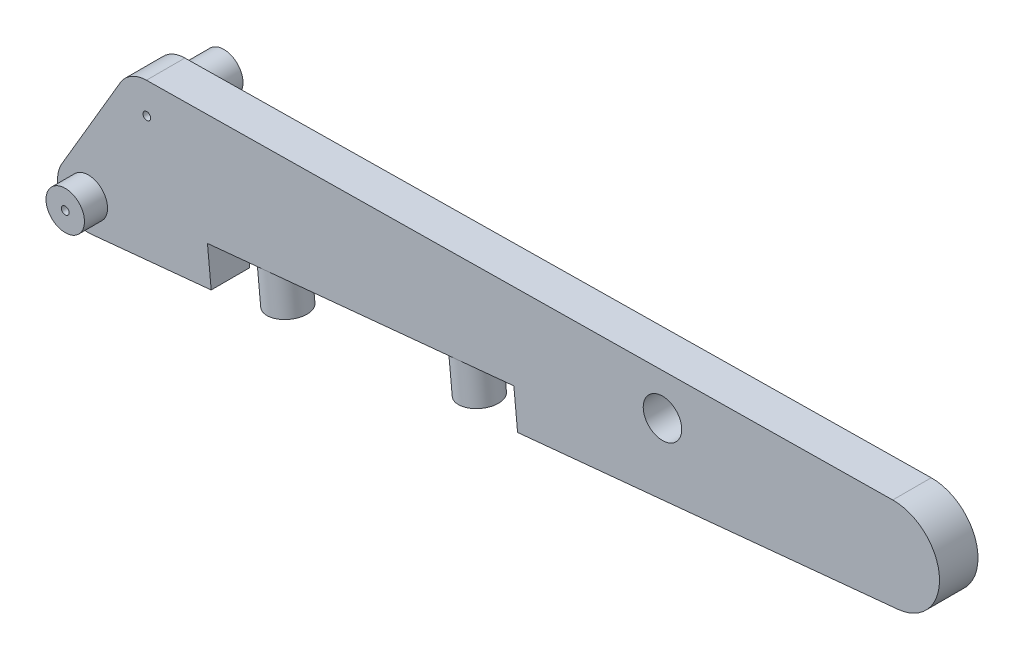
ISO-10303-21;
HEADER;
FILE_DESCRIPTION(('STEP AP214'),'2;1');
FILE_NAME('part.step','',(''),(''),'','','');
FILE_SCHEMA(('AUTOMOTIVE_DESIGN { 1 0 10303 214 1 1 1 1 }'));
ENDSEC;
DATA;
#1=APPLICATION_CONTEXT('core data for automotive mechanical design processes');
#2=APPLICATION_PROTOCOL_DEFINITION('international standard','automotive_design',2000,#1);
#3=PRODUCT_CONTEXT('',#1,'mechanical');
#4=PRODUCT('Part','Part','',(#3));
#5=PRODUCT_RELATED_PRODUCT_CATEGORY('part','',(#4));
#6=PRODUCT_DEFINITION_FORMATION('','',#4);
#7=PRODUCT_DEFINITION_CONTEXT('part definition',#1,'design');
#8=PRODUCT_DEFINITION('design','',#6,#7);
#9=PRODUCT_DEFINITION_SHAPE('','',#8);
#10=(LENGTH_UNIT() NAMED_UNIT(*) SI_UNIT(.MILLI.,.METRE.));
#11=(NAMED_UNIT(*) PLANE_ANGLE_UNIT() SI_UNIT($,.RADIAN.));
#12=(NAMED_UNIT(*) SI_UNIT($,.STERADIAN.) SOLID_ANGLE_UNIT());
#13=UNCERTAINTY_MEASURE_WITH_UNIT(LENGTH_MEASURE(1.E-05),#10,'distance_accuracy_value','');
#14=(GEOMETRIC_REPRESENTATION_CONTEXT(3) GLOBAL_UNCERTAINTY_ASSIGNED_CONTEXT((#13)) GLOBAL_UNIT_ASSIGNED_CONTEXT((#10,
#11,#12)) REPRESENTATION_CONTEXT('',''));
#15=CARTESIAN_POINT('',(0.,0.,0.));
#16=DIRECTION('',(0.,0.,1.));
#17=DIRECTION('',(1.,0.,0.));
#18=AXIS2_PLACEMENT_3D('',#15,#16,#17);
#19=CARTESIAN_POINT('',(47.6890944429912,-6.52502358700781,5.));
#20=DIRECTION('',(-0.0968281530487967,0.995301114626704,0.));
#21=DIRECTION('',(-0.995301114626704,-0.0968281530487967,0.));
#22=AXIS2_PLACEMENT_3D('',#19,#20,#21);
#23=PLANE('',#22);
#24=CARTESIAN_POINT('',(40.2243360832909,-7.25123473487379,2.5));
#25=DIRECTION('',(0.0968281530487967,-0.995301114626704,0.));
#26=DIRECTION('',(0.995301114626704,0.0968281530487967,0.));
#27=AXIS2_PLACEMENT_3D('',#24,#25,#26);
#28=CIRCLE('',#27,2.5);
#29=CARTESIAN_POINT('',(40.2243360832909,-7.25123473487379,0.));
#30=VERTEX_POINT('',#29);
#31=CARTESIAN_POINT('',(40.2243360832909,-7.25123473487379,5.));
#32=VERTEX_POINT('',#31);
#33=EDGE_CURVE('E150',#30,#32,#28,.T.);
#34=ORIENTED_EDGE('',*,*,#33,.F.);
#35=DIRECTION('',(0.995301114626704,0.0968281530487967,0.));
#36=VECTOR('',#35,1.);
#37=CARTESIAN_POINT('',(47.6890944429912,-6.52502358700781,0.));
#38=LINE('',#37,#36);
#39=CARTESIAN_POINT('',(47.6890944429912,-6.52502358700781,0.));
#40=VERTEX_POINT('',#39);
#41=EDGE_CURVE('E136',#30,#40,#38,.T.);
#42=ORIENTED_EDGE('',*,*,#41,.T.);
#43=DIRECTION('',(0.,0.,-1.));
#44=VECTOR('',#43,1.);
#45=CARTESIAN_POINT('',(47.6890944429912,-6.52502358700781,5.));
#46=LINE('',#45,#44);
#47=CARTESIAN_POINT('',(47.6890944429912,-6.52502358700781,5.));
#48=VERTEX_POINT('',#47);
#49=EDGE_CURVE('E199',#48,#40,#46,.T.);
#50=ORIENTED_EDGE('',*,*,#49,.F.);
#51=DIRECTION('',(0.995301114626704,0.0968281530487967,0.));
#52=VECTOR('',#51,1.);
#53=CARTESIAN_POINT('',(47.6890944429912,-6.52502358700781,5.));
#54=LINE('',#53,#52);
#55=EDGE_CURVE('E151',#32,#48,#54,.T.);
#56=ORIENTED_EDGE('',*,*,#55,.F.);
#57=EDGE_LOOP('',(#34,#42,#50,#56));
#58=FACE_BOUND('',#57,.T.);
#59=ADVANCED_FACE('F39',(#58),#23,.F.);
#60=EDGE_CURVE('E55',#32,#30,#28,.T.);
#61=ORIENTED_EDGE('',*,*,#60,.F.);
#62=CARTESIAN_POINT('',(15.3418082176233,-9.6719385610937,5.));
#63=VERTEX_POINT('',#62);
#64=EDGE_CURVE('E192',#63,#32,#54,.T.);
#65=ORIENTED_EDGE('',*,*,#64,.F.);
#66=CARTESIAN_POINT('',(15.3418082176233,-9.6719385610937,2.5));
#67=DIRECTION('',(-0.0968281530487967,0.995301114626704,0.));
#68=DIRECTION('',(-0.995301114626704,-0.0968281530487967,0.));
#69=AXIS2_PLACEMENT_3D('',#66,#67,#68);
#70=CIRCLE('',#69,2.5);
#71=CARTESIAN_POINT('',(15.3418082176233,-9.67193856109371,0.));
#72=VERTEX_POINT('',#71);
#73=EDGE_CURVE('E11',#72,#63,#70,.F.);
#74=ORIENTED_EDGE('',*,*,#73,.F.);
#75=EDGE_CURVE('E129',#72,#30,#38,.T.);
#76=ORIENTED_EDGE('',*,*,#75,.T.);
#77=EDGE_LOOP('',(#61,#65,#74,#76));
#78=FACE_BOUND('',#77,.T.);
#79=ADVANCED_FACE('F131',(#78),#23,.F.);
#80=CARTESIAN_POINT('',(97.5809689182928,-6.71860047068932,5.));
#81=DIRECTION('',(-0.0968281530487968,0.995301114626704,0.));
#82=DIRECTION('',(-0.995301114626704,-0.0968281530487968,0.));
#83=AXIS2_PLACEMENT_3D('',#80,#81,#82);
#84=PLANE('',#83);
#85=DIRECTION('',(0.995301114626704,0.0968281530487968,0.));
#86=VECTOR('',#85,1.);
#87=CARTESIAN_POINT('',(97.5809689182928,-6.71860047068932,5.));
#88=LINE('',#87,#86);
#89=CARTESIAN_POINT('',(48.1755208702595,-11.5250235870078,5.));
#90=VERTEX_POINT('',#89);
#91=CARTESIAN_POINT('',(97.5809689182928,-6.71860047068932,5.));
#92=VERTEX_POINT('',#91);
#93=EDGE_CURVE('E263',#90,#92,#88,.T.);
#94=ORIENTED_EDGE('',*,*,#93,.F.);
#95=DIRECTION('',(0.,0.,-1.));
#96=VECTOR('',#95,1.);
#97=CARTESIAN_POINT('',(48.1755208702595,-11.5250235870078,5.));
#98=LINE('',#97,#96);
#99=CARTESIAN_POINT('',(48.1755208702595,-11.5250235870078,0.));
#100=VERTEX_POINT('',#99);
#101=EDGE_CURVE('E191',#90,#100,#98,.T.);
#102=ORIENTED_EDGE('',*,*,#101,.T.);
#103=DIRECTION('',(0.995301114626704,0.0968281530487968,0.));
#104=VECTOR('',#103,1.);
#105=CARTESIAN_POINT('',(97.5809689182928,-6.71860047068932,0.));
#106=LINE('',#105,#104);
#107=CARTESIAN_POINT('',(97.5809689182928,-6.71860047068932,0.));
#108=VERTEX_POINT('',#107);
#109=EDGE_CURVE('E284',#100,#108,#106,.T.);
#110=ORIENTED_EDGE('',*,*,#109,.T.);
#111=DIRECTION('',(0.,0.,-1.));
#112=VECTOR('',#111,1.);
#113=CARTESIAN_POINT('',(97.5809689182928,-6.71860047068932,5.));
#114=LINE('',#113,#112);
#115=EDGE_CURVE('E301',#92,#108,#114,.T.);
#116=ORIENTED_EDGE('',*,*,#115,.F.);
#117=EDGE_LOOP('',(#94,#102,#110,#116));
#118=FACE_BOUND('',#117,.T.);
#119=ADVANCED_FACE('F354',(#118),#84,.F.);
#120=CARTESIAN_POINT('',(0.,0.,5.));
#121=DIRECTION('',(0.,0.,1.));
#122=DIRECTION('',(1.,0.,0.));
#123=AXIS2_PLACEMENT_3D('',#120,#121,#122);
#124=PLANE('',#123);
#125=DIRECTION('',(0.0968281530487984,-0.995301114626703,0.));
#126=VECTOR('',#125,1.);
#127=CARTESIAN_POINT('',(48.1755208702595,-11.5250235870078,5.));
#128=LINE('',#127,#126);
#129=EDGE_CURVE('E179',#48,#90,#128,.T.);
#130=ORIENTED_EDGE('',*,*,#129,.T.);
#131=ORIENTED_EDGE('',*,*,#93,.T.);
#132=CARTESIAN_POINT('',(97.,-0.746793782929099,5.));
#133=DIRECTION('',(0.,0.,1.));
#134=DIRECTION('',(1.,0.,0.));
#135=AXIS2_PLACEMENT_3D('',#132,#133,#134);
#136=CIRCLE('',#135,6.);
#137=CARTESIAN_POINT('',(96.9224782338776,5.25270539415037,5.));
#138=VERTEX_POINT('',#137);
#139=EDGE_CURVE('E268',#92,#138,#136,.T.);
#140=ORIENTED_EDGE('',*,*,#139,.T.);
#141=DIRECTION('',(-0.999916529513246,-0.0129202943537264,0.));
#142=VECTOR('',#141,1.);
#143=CARTESIAN_POINT('',(-0.0516811774149059,3.99966611805298,5.));
#144=LINE('',#143,#142);
#145=CARTESIAN_POINT('',(-0.0516811774149059,3.99966611805298,5.));
#146=VERTEX_POINT('',#145);
#147=EDGE_CURVE('E271',#138,#146,#144,.T.);
#148=ORIENTED_EDGE('',*,*,#147,.T.);
#149=CARTESIAN_POINT('',(0.,0.,5.));
#150=DIRECTION('',(0.,0.,1.));
#151=DIRECTION('',(1.,0.,0.));
#152=AXIS2_PLACEMENT_3D('',#149,#150,#151);
#153=CIRCLE('',#152,4.);
#154=CARTESIAN_POINT('',(-3.4486016019758,2.02660972830239,5.));
#155=VERTEX_POINT('',#154);
#156=EDGE_CURVE('E252',#146,#155,#153,.T.);
#157=ORIENTED_EDGE('',*,*,#156,.T.);
#158=DIRECTION('',(-0.506652432075599,-0.862150400493951,0.));
#159=VECTOR('',#158,1.);
#160=CARTESIAN_POINT('',(-11.0483880831098,-10.9056462791069,5.));
#161=LINE('',#160,#159);
#162=CARTESIAN_POINT('',(-11.0483880831098,-10.9056462791069,5.));
#163=VERTEX_POINT('',#162);
#164=EDGE_CURVE('E256',#155,#163,#161,.T.);
#165=ORIENTED_EDGE('',*,*,#164,.T.);
#166=CARTESIAN_POINT('',(-7.59978648113398,-12.9322560074093,5.));
#167=DIRECTION('',(0.,0.,1.));
#168=DIRECTION('',(1.,0.,0.));
#169=AXIS2_PLACEMENT_3D('',#166,#167,#168);
#170=CIRCLE('',#169,4.);
#171=CARTESIAN_POINT('',(-7.21247386893879,-16.9134604659161,5.));
#172=VERTEX_POINT('',#171);
#173=EDGE_CURVE('E260',#163,#172,#170,.T.);
#174=ORIENTED_EDGE('',*,*,#173,.T.);
#175=CARTESIAN_POINT('',(8.36347628519138,-15.3981497089597,5.));
#176=VERTEX_POINT('',#175);
#177=EDGE_CURVE('E264',#172,#176,#88,.T.);
#178=ORIENTED_EDGE('',*,*,#177,.T.);
#179=DIRECTION('',(-0.0968281530487964,0.995301114626704,0.));
#180=VECTOR('',#179,1.);
#181=CARTESIAN_POINT('',(8.3634762851913,-15.3981497089597,5.));
#182=LINE('',#181,#180);
#183=CARTESIAN_POINT('',(7.87704985792304,-10.3981497089597,5.));
#184=VERTEX_POINT('',#183);
#185=EDGE_CURVE('E183',#176,#184,#182,.T.);
#186=ORIENTED_EDGE('',*,*,#185,.T.);
#187=EDGE_CURVE('E187',#184,#63,#54,.T.);
#188=ORIENTED_EDGE('',*,*,#187,.T.);
#189=ORIENTED_EDGE('',*,*,#64,.T.);
#190=ORIENTED_EDGE('',*,*,#55,.T.);
#191=EDGE_LOOP('',(#130,#131,#140,#148,#157,#165,#174,#178,#186,#188,#189,#190));
#192=FACE_BOUND('',#191,.T.);
#193=CARTESIAN_POINT('',(67.,-0.515826633569584,5.));
#194=DIRECTION('',(0.,0.,-1.));
#195=DIRECTION('',(-1.,0.,0.));
#196=AXIS2_PLACEMENT_3D('',#193,#194,#195);
#197=CIRCLE('',#196,2.49999999999999);
#198=CARTESIAN_POINT('',(64.5,-0.515826633569584,5.));
#199=VERTEX_POINT('',#198);
#200=EDGE_CURVE('E212',#199,#199,#197,.T.);
#201=ORIENTED_EDGE('',*,*,#200,.T.);
#202=EDGE_LOOP('',(#201));
#203=FACE_BOUND('',#202,.T.);
#204=CARTESIAN_POINT('',(-7.59978648113398,-12.9322560074093,5.));
#205=DIRECTION('',(0.,0.,1.));
#206=DIRECTION('',(1.,0.,0.));
#207=AXIS2_PLACEMENT_3D('',#204,#205,#206);
#208=CIRCLE('',#207,2.5);
#209=CARTESIAN_POINT('',(-5.09978648113398,-12.9322560074093,5.));
#210=VERTEX_POINT('',#209);
#211=EDGE_CURVE('E247',#210,#210,#208,.T.);
#212=ORIENTED_EDGE('',*,*,#211,.F.);
#213=EDGE_LOOP('',(#212));
#214=FACE_BOUND('',#213,.T.);
#215=CARTESIAN_POINT('',(0.,0.,5.));
#216=DIRECTION('',(0.,0.,1.));
#217=DIRECTION('',(1.,0.,0.));
#218=AXIS2_PLACEMENT_3D('',#215,#216,#217);
#219=CIRCLE('',#218,0.5);
#220=CARTESIAN_POINT('',(0.5,0.,5.));
#221=VERTEX_POINT('',#220);
#222=EDGE_CURVE('E231',#221,#221,#219,.T.);
#223=ORIENTED_EDGE('',*,*,#222,.F.);
#224=EDGE_LOOP('',(#223));
#225=FACE_BOUND('',#224,.T.);
#226=ADVANCED_FACE('F336',(#192,#203,#214,#225),#124,.T.);
#227=CARTESIAN_POINT('',(0.,0.,0.));
#228=DIRECTION('',(0.,0.,1.));
#229=DIRECTION('',(1.,0.,0.));
#230=AXIS2_PLACEMENT_3D('',#227,#228,#229);
#231=PLANE('',#230);
#232=CARTESIAN_POINT('',(67.,-0.515826633569584,0.));
#233=DIRECTION('',(0.,0.,-1.));
#234=DIRECTION('',(-1.,0.,0.));
#235=AXIS2_PLACEMENT_3D('',#232,#233,#234);
#236=CIRCLE('',#235,2.49999999999999);
#237=CARTESIAN_POINT('',(64.5,-0.515826633569584,0.));
#238=VERTEX_POINT('',#237);
#239=EDGE_CURVE('E202',#238,#238,#236,.T.);
#240=ORIENTED_EDGE('',*,*,#239,.F.);
#241=EDGE_LOOP('',(#240));
#242=FACE_BOUND('',#241,.T.);
#243=ORIENTED_EDGE('',*,*,#109,.F.);
#244=DIRECTION('',(0.0968281530487984,-0.995301114626703,0.));
#245=VECTOR('',#244,1.);
#246=CARTESIAN_POINT('',(48.1755208702595,-11.5250235870078,0.));
#247=LINE('',#246,#245);
#248=EDGE_CURVE('E143',#40,#100,#247,.T.);
#249=ORIENTED_EDGE('',*,*,#248,.F.);
#250=ORIENTED_EDGE('',*,*,#41,.F.);
#251=ORIENTED_EDGE('',*,*,#75,.F.);
#252=CARTESIAN_POINT('',(7.87704985792304,-10.3981497089597,0.));
#253=VERTEX_POINT('',#252);
#254=EDGE_CURVE('E135',#253,#72,#38,.T.);
#255=ORIENTED_EDGE('',*,*,#254,.F.);
#256=DIRECTION('',(-0.0968281530487964,0.995301114626704,0.));
#257=VECTOR('',#256,1.);
#258=CARTESIAN_POINT('',(8.3634762851913,-15.3981497089597,0.));
#259=LINE('',#258,#257);
#260=CARTESIAN_POINT('',(8.3634762851913,-15.3981497089597,0.));
#261=VERTEX_POINT('',#260);
#262=EDGE_CURVE('E148',#261,#253,#259,.T.);
#263=ORIENTED_EDGE('',*,*,#262,.F.);
#264=CARTESIAN_POINT('',(-7.21247386893879,-16.9134604659161,0.));
#265=VERTEX_POINT('',#264);
#266=EDGE_CURVE('E285',#265,#261,#106,.T.);
#267=ORIENTED_EDGE('',*,*,#266,.F.);
#268=CARTESIAN_POINT('',(-7.59978648113398,-12.9322560074093,0.));
#269=DIRECTION('',(0.,0.,1.));
#270=DIRECTION('',(1.,0.,0.));
#271=AXIS2_PLACEMENT_3D('',#268,#269,#270);
#272=CIRCLE('',#271,4.);
#273=CARTESIAN_POINT('',(-11.0483880831098,-10.9056462791069,0.));
#274=VERTEX_POINT('',#273);
#275=EDGE_CURVE('E281',#274,#265,#272,.T.);
#276=ORIENTED_EDGE('',*,*,#275,.F.);
#277=DIRECTION('',(-0.506652432075599,-0.862150400493951,0.));
#278=VECTOR('',#277,1.);
#279=CARTESIAN_POINT('',(-11.0483880831098,-10.9056462791069,0.));
#280=LINE('',#279,#278);
#281=CARTESIAN_POINT('',(-3.4486016019758,2.02660972830239,0.));
#282=VERTEX_POINT('',#281);
#283=EDGE_CURVE('E278',#282,#274,#280,.T.);
#284=ORIENTED_EDGE('',*,*,#283,.F.);
#285=CARTESIAN_POINT('',(0.,0.,0.));
#286=DIRECTION('',(0.,0.,1.));
#287=DIRECTION('',(1.,0.,0.));
#288=AXIS2_PLACEMENT_3D('',#285,#286,#287);
#289=CIRCLE('',#288,4.);
#290=CARTESIAN_POINT('',(-0.0516811774149059,3.99966611805298,0.));
#291=VERTEX_POINT('',#290);
#292=EDGE_CURVE('E251',#291,#282,#289,.T.);
#293=ORIENTED_EDGE('',*,*,#292,.F.);
#294=DIRECTION('',(-0.999916529513246,-0.0129202943537264,0.));
#295=VECTOR('',#294,1.);
#296=CARTESIAN_POINT('',(-0.0516811774149059,3.99966611805298,0.));
#297=LINE('',#296,#295);
#298=CARTESIAN_POINT('',(96.9224782338776,5.25270539415037,0.));
#299=VERTEX_POINT('',#298);
#300=EDGE_CURVE('E257',#299,#291,#297,.T.);
#301=ORIENTED_EDGE('',*,*,#300,.F.);
#302=CARTESIAN_POINT('',(97.,-0.746793782929099,0.));
#303=DIRECTION('',(0.,0.,1.));
#304=DIRECTION('',(1.,0.,0.));
#305=AXIS2_PLACEMENT_3D('',#302,#303,#304);
#306=CIRCLE('',#305,6.);
#307=EDGE_CURVE('E289',#108,#299,#306,.T.);
#308=ORIENTED_EDGE('',*,*,#307,.F.);
#309=EDGE_LOOP('',(#243,#249,#250,#251,#255,#263,#267,#276,#284,#293,#301,#308));
#310=FACE_BOUND('',#309,.T.);
#311=CARTESIAN_POINT('',(0.,0.,0.));
#312=DIRECTION('',(0.,0.,1.));
#313=DIRECTION('',(1.,0.,0.));
#314=AXIS2_PLACEMENT_3D('',#311,#312,#313);
#315=CIRCLE('',#314,2.5);
#316=CARTESIAN_POINT('',(2.5,0.,0.));
#317=VERTEX_POINT('',#316);
#318=EDGE_CURVE('E243',#317,#317,#315,.T.);
#319=ORIENTED_EDGE('',*,*,#318,.T.);
#320=EDGE_LOOP('',(#319));
#321=FACE_BOUND('',#320,.T.);
#322=CARTESIAN_POINT('',(-7.59978648113398,-12.9322560074093,0.));
#323=DIRECTION('',(0.,0.,-1.));
#324=DIRECTION('',(-1.,0.,0.));
#325=AXIS2_PLACEMENT_3D('',#322,#323,#324);
#326=CIRCLE('',#325,0.500000000000001);
#327=CARTESIAN_POINT('',(-8.09978648113398,-12.9322560074093,0.));
#328=VERTEX_POINT('',#327);
#329=EDGE_CURVE('E216',#328,#328,#326,.T.);
#330=ORIENTED_EDGE('',*,*,#329,.F.);
#331=EDGE_LOOP('',(#330));
#332=FACE_BOUND('',#331,.T.);
#333=ADVANCED_FACE('F141',(#242,#310,#321,#332),#231,.F.);
#334=CARTESIAN_POINT('',(0.,0.,5.));
#335=DIRECTION('',(0.,0.,-1.));
#336=DIRECTION('',(-1.,0.,0.));
#337=AXIS2_PLACEMENT_3D('',#334,#335,#336);
#338=CYLINDRICAL_SURFACE('',#337,4.);
#339=ORIENTED_EDGE('',*,*,#292,.T.);
#340=DIRECTION('',(0.,0.,-1.));
#341=VECTOR('',#340,1.);
#342=CARTESIAN_POINT('',(-3.4486016019758,2.02660972830239,5.));
#343=LINE('',#342,#341);
#344=EDGE_CURVE('E48',#155,#282,#343,.T.);
#345=ORIENTED_EDGE('',*,*,#344,.F.);
#346=ORIENTED_EDGE('',*,*,#156,.F.);
#347=DIRECTION('',(0.,0.,-1.));
#348=VECTOR('',#347,1.);
#349=CARTESIAN_POINT('',(-0.0516811774149059,3.99966611805298,5.));
#350=LINE('',#349,#348);
#351=EDGE_CURVE('E274',#146,#291,#350,.T.);
#352=ORIENTED_EDGE('',*,*,#351,.T.);
#353=EDGE_LOOP('',(#339,#345,#346,#352));
#354=FACE_BOUND('',#353,.T.);
#355=ADVANCED_FACE('F41',(#354),#338,.T.);
#356=CARTESIAN_POINT('',(-11.0483880831098,-10.9056462791069,5.));
#357=DIRECTION('',(0.862150400493951,-0.506652432075599,0.));
#358=DIRECTION('',(0.506652432075599,0.862150400493952,0.));
#359=AXIS2_PLACEMENT_3D('',#356,#357,#358);
#360=PLANE('',#359);
#361=ORIENTED_EDGE('',*,*,#283,.T.);
#362=DIRECTION('',(0.,0.,-1.));
#363=VECTOR('',#362,1.);
#364=CARTESIAN_POINT('',(-11.0483880831098,-10.9056462791069,5.));
#365=LINE('',#364,#363);
#366=EDGE_CURVE('E309',#163,#274,#365,.T.);
#367=ORIENTED_EDGE('',*,*,#366,.F.);
#368=ORIENTED_EDGE('',*,*,#164,.F.);
#369=ORIENTED_EDGE('',*,*,#344,.T.);
#370=EDGE_LOOP('',(#361,#367,#368,#369));
#371=FACE_BOUND('',#370,.T.);
#372=ADVANCED_FACE('F316',(#371),#360,.F.);
#373=CARTESIAN_POINT('',(-7.59978648113398,-12.9322560074093,5.));
#374=DIRECTION('',(0.,0.,-1.));
#375=DIRECTION('',(-1.,0.,0.));
#376=AXIS2_PLACEMENT_3D('',#373,#374,#375);
#377=CYLINDRICAL_SURFACE('',#376,4.);
#378=ORIENTED_EDGE('',*,*,#275,.T.);
#379=DIRECTION('',(0.,0.,-1.));
#380=VECTOR('',#379,1.);
#381=CARTESIAN_POINT('',(-7.21247386893879,-16.9134604659161,5.));
#382=LINE('',#381,#380);
#383=EDGE_CURVE('E305',#172,#265,#382,.T.);
#384=ORIENTED_EDGE('',*,*,#383,.F.);
#385=ORIENTED_EDGE('',*,*,#173,.F.);
#386=ORIENTED_EDGE('',*,*,#366,.T.);
#387=EDGE_LOOP('',(#378,#384,#385,#386));
#388=FACE_BOUND('',#387,.T.);
#389=ADVANCED_FACE('F329',(#388),#377,.T.);
#390=ORIENTED_EDGE('',*,*,#266,.T.);
#391=DIRECTION('',(0.,0.,-1.));
#392=VECTOR('',#391,1.);
#393=CARTESIAN_POINT('',(8.3634762851913,-15.3981497089597,5.));
#394=LINE('',#393,#392);
#395=EDGE_CURVE('E206',#176,#261,#394,.T.);
#396=ORIENTED_EDGE('',*,*,#395,.F.);
#397=ORIENTED_EDGE('',*,*,#177,.F.);
#398=ORIENTED_EDGE('',*,*,#383,.T.);
#399=EDGE_LOOP('',(#390,#396,#397,#398));
#400=FACE_BOUND('',#399,.T.);
#401=ADVANCED_FACE('F333',(#400),#84,.F.);
#402=CARTESIAN_POINT('',(97.,-0.746793782929099,5.));
#403=DIRECTION('',(0.,0.,-1.));
#404=DIRECTION('',(-1.,0.,0.));
#405=AXIS2_PLACEMENT_3D('',#402,#403,#404);
#406=CYLINDRICAL_SURFACE('',#405,6.);
#407=ORIENTED_EDGE('',*,*,#307,.T.);
#408=DIRECTION('',(0.,0.,-1.));
#409=VECTOR('',#408,1.);
#410=CARTESIAN_POINT('',(96.9224782338776,5.25270539415037,5.));
#411=LINE('',#410,#409);
#412=EDGE_CURVE('E297',#138,#299,#411,.T.);
#413=ORIENTED_EDGE('',*,*,#412,.F.);
#414=ORIENTED_EDGE('',*,*,#139,.F.);
#415=ORIENTED_EDGE('',*,*,#115,.T.);
#416=EDGE_LOOP('',(#407,#413,#414,#415));
#417=FACE_BOUND('',#416,.T.);
#418=ADVANCED_FACE('F344',(#417),#406,.T.);
#419=CARTESIAN_POINT('',(-0.0516811774149059,3.99966611805298,5.));
#420=DIRECTION('',(0.0129202943537264,-0.999916529513245,0.));
#421=DIRECTION('',(0.999916529513246,0.0129202943537264,0.));
#422=AXIS2_PLACEMENT_3D('',#419,#420,#421);
#423=PLANE('',#422);
#424=ORIENTED_EDGE('',*,*,#300,.T.);
#425=ORIENTED_EDGE('',*,*,#351,.F.);
#426=ORIENTED_EDGE('',*,*,#147,.F.);
#427=ORIENTED_EDGE('',*,*,#412,.T.);
#428=EDGE_LOOP('',(#424,#425,#426,#427));
#429=FACE_BOUND('',#428,.T.);
#430=ADVANCED_FACE('F342',(#429),#423,.F.);
#431=CARTESIAN_POINT('',(0.,0.,-5.));
#432=DIRECTION('',(0.,0.,1.));
#433=DIRECTION('',(1.,0.,0.));
#434=AXIS2_PLACEMENT_3D('',#431,#432,#433);
#435=CYLINDRICAL_SURFACE('',#434,2.5);
#436=CARTESIAN_POINT('',(0.,0.,-5.));
#437=DIRECTION('',(0.,0.,1.));
#438=DIRECTION('',(1.,0.,0.));
#439=AXIS2_PLACEMENT_3D('',#436,#437,#438);
#440=CIRCLE('',#439,2.5);
#441=CARTESIAN_POINT('',(2.5,0.,-5.));
#442=VERTEX_POINT('',#441);
#443=EDGE_CURVE('E236',#442,#442,#440,.T.);
#444=ORIENTED_EDGE('',*,*,#443,.T.);
#445=EDGE_LOOP('',(#444));
#446=FACE_BOUND('',#445,.T.);
#447=ORIENTED_EDGE('',*,*,#318,.F.);
#448=EDGE_LOOP('',(#447));
#449=FACE_BOUND('',#448,.T.);
#450=ADVANCED_FACE('F563',(#446,#449),#435,.T.);
#451=CARTESIAN_POINT('',(0.,0.,-5.));
#452=DIRECTION('',(0.,0.,1.));
#453=DIRECTION('',(1.,0.,0.));
#454=AXIS2_PLACEMENT_3D('',#451,#452,#453);
#455=PLANE('',#454);
#456=CARTESIAN_POINT('',(0.,0.,-5.));
#457=DIRECTION('',(0.,0.,1.));
#458=DIRECTION('',(1.,0.,0.));
#459=AXIS2_PLACEMENT_3D('',#456,#457,#458);
#460=CIRCLE('',#459,0.5);
#461=CARTESIAN_POINT('',(0.5,0.,-5.));
#462=VERTEX_POINT('',#461);
#463=EDGE_CURVE('E232',#462,#462,#460,.T.);
#464=ORIENTED_EDGE('',*,*,#463,.T.);
#465=EDGE_LOOP('',(#464));
#466=FACE_BOUND('',#465,.T.);
#467=ORIENTED_EDGE('',*,*,#443,.F.);
#468=EDGE_LOOP('',(#467));
#469=FACE_BOUND('',#468,.T.);
#470=ADVANCED_FACE('F554',(#466,#469),#455,.F.);
#471=CARTESIAN_POINT('',(0.,0.,-5.));
#472=DIRECTION('',(0.,0.,1.));
#473=DIRECTION('',(1.,0.,0.));
#474=AXIS2_PLACEMENT_3D('',#471,#472,#473);
#475=CYLINDRICAL_SURFACE('',#474,0.5);
#476=ORIENTED_EDGE('',*,*,#463,.F.);
#477=EDGE_LOOP('',(#476));
#478=FACE_BOUND('',#477,.T.);
#479=ORIENTED_EDGE('',*,*,#222,.T.);
#480=EDGE_LOOP('',(#479));
#481=FACE_BOUND('',#480,.T.);
#482=ADVANCED_FACE('F537',(#478,#481),#475,.F.);
#483=CARTESIAN_POINT('',(-7.59978648113398,-12.9322560074093,8.));
#484=DIRECTION('',(0.,0.,-1.));
#485=DIRECTION('',(-1.,0.,0.));
#486=AXIS2_PLACEMENT_3D('',#483,#484,#485);
#487=CYLINDRICAL_SURFACE('',#486,2.5);
#488=ORIENTED_EDGE('',*,*,#211,.T.);
#489=EDGE_LOOP('',(#488));
#490=FACE_BOUND('',#489,.T.);
#491=CARTESIAN_POINT('',(-7.59978648113398,-12.9322560074093,8.));
#492=DIRECTION('',(0.,0.,-1.));
#493=DIRECTION('',(-1.,0.,0.));
#494=AXIS2_PLACEMENT_3D('',#491,#492,#493);
#495=CIRCLE('',#494,2.5);
#496=CARTESIAN_POINT('',(-10.099786481134,-12.9322560074093,8.));
#497=VERTEX_POINT('',#496);
#498=EDGE_CURVE('E224',#497,#497,#495,.T.);
#499=ORIENTED_EDGE('',*,*,#498,.T.);
#500=EDGE_LOOP('',(#499));
#501=FACE_BOUND('',#500,.T.);
#502=ADVANCED_FACE('F529',(#490,#501),#487,.T.);
#503=CARTESIAN_POINT('',(-7.59978648113398,-12.9322560074093,8.));
#504=DIRECTION('',(0.,0.,-1.));
#505=DIRECTION('',(-1.,0.,0.));
#506=AXIS2_PLACEMENT_3D('',#503,#504,#505);
#507=PLANE('',#506);
#508=CARTESIAN_POINT('',(-7.59978648113398,-12.9322560074093,8.));
#509=DIRECTION('',(0.,0.,-1.));
#510=DIRECTION('',(-1.,0.,0.));
#511=AXIS2_PLACEMENT_3D('',#508,#509,#510);
#512=CIRCLE('',#511,0.500000000000001);
#513=CARTESIAN_POINT('',(-8.09978648113398,-12.9322560074093,8.));
#514=VERTEX_POINT('',#513);
#515=EDGE_CURVE('E220',#514,#514,#512,.T.);
#516=ORIENTED_EDGE('',*,*,#515,.T.);
#517=EDGE_LOOP('',(#516));
#518=FACE_BOUND('',#517,.T.);
#519=ORIENTED_EDGE('',*,*,#498,.F.);
#520=EDGE_LOOP('',(#519));
#521=FACE_BOUND('',#520,.T.);
#522=ADVANCED_FACE('F520',(#518,#521),#507,.F.);
#523=CARTESIAN_POINT('',(-7.59978648113398,-12.9322560074093,8.));
#524=DIRECTION('',(0.,0.,-1.));
#525=DIRECTION('',(-1.,0.,0.));
#526=AXIS2_PLACEMENT_3D('',#523,#524,#525);
#527=CYLINDRICAL_SURFACE('',#526,0.500000000000001);
#528=ORIENTED_EDGE('',*,*,#515,.F.);
#529=EDGE_LOOP('',(#528));
#530=FACE_BOUND('',#529,.T.);
#531=ORIENTED_EDGE('',*,*,#329,.T.);
#532=EDGE_LOOP('',(#531));
#533=FACE_BOUND('',#532,.T.);
#534=ADVANCED_FACE('F511',(#530,#533),#527,.F.);
#535=CARTESIAN_POINT('',(67.,-0.515826633569584,5.));
#536=DIRECTION('',(0.,0.,-1.));
#537=DIRECTION('',(-1.,0.,0.));
#538=AXIS2_PLACEMENT_3D('',#535,#536,#537);
#539=CYLINDRICAL_SURFACE('',#538,2.49999999999999);
#540=ORIENTED_EDGE('',*,*,#200,.F.);
#541=EDGE_LOOP('',(#540));
#542=FACE_BOUND('',#541,.T.);
#543=ORIENTED_EDGE('',*,*,#239,.T.);
#544=EDGE_LOOP('',(#543));
#545=FACE_BOUND('',#544,.T.);
#546=ADVANCED_FACE('F388',(#542,#545),#539,.F.);
#547=CARTESIAN_POINT('',(48.1755208702595,-11.5250235870078,5.));
#548=DIRECTION('',(0.995301114626704,0.0968281530487984,0.));
#549=DIRECTION('',(-0.0968281530487984,0.995301114626704,0.));
#550=AXIS2_PLACEMENT_3D('',#547,#548,#549);
#551=PLANE('',#550);
#552=ORIENTED_EDGE('',*,*,#248,.T.);
#553=ORIENTED_EDGE('',*,*,#101,.F.);
#554=ORIENTED_EDGE('',*,*,#129,.F.);
#555=ORIENTED_EDGE('',*,*,#49,.T.);
#556=EDGE_LOOP('',(#552,#553,#554,#555));
#557=FACE_BOUND('',#556,.T.);
#558=ADVANCED_FACE('F353',(#557),#551,.F.);
#559=CARTESIAN_POINT('',(15.3418082176233,-9.67193856109371,2.5));
#560=DIRECTION('',(0.0968281530487967,-0.995301114626704,0.));
#561=DIRECTION('',(0.995301114626704,0.0968281530487967,0.));
#562=AXIS2_PLACEMENT_3D('',#559,#560,#561);
#563=CIRCLE('',#562,2.5);
#564=EDGE_CURVE('E63',#63,#72,#563,.T.);
#565=ORIENTED_EDGE('',*,*,#564,.F.);
#566=ORIENTED_EDGE('',*,*,#187,.F.);
#567=DIRECTION('',(0.,0.,-1.));
#568=VECTOR('',#567,1.);
#569=CARTESIAN_POINT('',(7.87704985792304,-10.3981497089597,5.));
#570=LINE('',#569,#568);
#571=EDGE_CURVE('E203',#184,#253,#570,.T.);
#572=ORIENTED_EDGE('',*,*,#571,.T.);
#573=ORIENTED_EDGE('',*,*,#254,.T.);
#574=EDGE_LOOP('',(#565,#566,#572,#573));
#575=FACE_BOUND('',#574,.T.);
#576=ADVANCED_FACE('F371',(#575),#23,.F.);
#577=CARTESIAN_POINT('',(8.3634762851913,-15.3981497089597,5.));
#578=DIRECTION('',(-0.995301114626704,-0.0968281530487964,0.));
#579=DIRECTION('',(0.0968281530487964,-0.995301114626704,0.));
#580=AXIS2_PLACEMENT_3D('',#577,#578,#579);
#581=PLANE('',#580);
#582=ORIENTED_EDGE('',*,*,#262,.T.);
#583=ORIENTED_EDGE('',*,*,#571,.F.);
#584=ORIENTED_EDGE('',*,*,#185,.F.);
#585=ORIENTED_EDGE('',*,*,#395,.T.);
#586=EDGE_LOOP('',(#582,#583,#584,#585));
#587=FACE_BOUND('',#586,.T.);
#588=ADVANCED_FACE('F381',(#587),#581,.F.);
#589=CARTESIAN_POINT('',(15.8259489828673,-14.6484441342272,2.5));
#590=DIRECTION('',(0.0968281530487967,-0.995301114626704,0.));
#591=DIRECTION('',(0.995301114626704,0.0968281530487967,0.));
#592=AXIS2_PLACEMENT_3D('',#589,#590,#591);
#593=PLANE('',#592);
#594=CARTESIAN_POINT('',(15.8259489828673,-14.6484441342272,2.5));
#595=DIRECTION('',(0.0968281530487967,-0.995301114626704,0.));
#596=DIRECTION('',(0.995301114626704,0.0968281530487967,0.));
#597=AXIS2_PLACEMENT_3D('',#594,#595,#596);
#598=CIRCLE('',#597,2.5);
#599=CARTESIAN_POINT('',(18.3142017694341,-14.4063737516052,2.5));
#600=VERTEX_POINT('',#599);
#601=EDGE_CURVE('E173',#600,#600,#598,.T.);
#602=ORIENTED_EDGE('',*,*,#601,.T.);
#603=EDGE_LOOP('',(#602));
#604=FACE_BOUND('',#603,.T.);
#605=CARTESIAN_POINT('',(15.8259489828673,-14.6484441342272,2.5));
#606=DIRECTION('',(0.0968281530487967,-0.995301114626704,0.));
#607=DIRECTION('',(0.995301114626704,0.0968281530487967,0.));
#608=AXIS2_PLACEMENT_3D('',#605,#606,#607);
#609=CIRCLE('',#608,0.499999999999997);
#610=CARTESIAN_POINT('',(16.3235995401806,-14.6000300577028,2.5));
#611=VERTEX_POINT('',#610);
#612=EDGE_CURVE('E166',#611,#611,#609,.T.);
#613=ORIENTED_EDGE('',*,*,#612,.F.);
#614=EDGE_LOOP('',(#613));
#615=FACE_BOUND('',#614,.T.);
#616=ADVANCED_FACE('F386',(#604,#615),#593,.T.);
#617=CARTESIAN_POINT('',(15.8259489828673,-14.6484441342272,2.5));
#618=DIRECTION('',(-0.0968281530487967,0.995301114626704,0.));
#619=DIRECTION('',(-0.995301114626704,-0.0968281530487967,0.));
#620=AXIS2_PLACEMENT_3D('',#617,#618,#619);
#621=CYLINDRICAL_SURFACE('',#620,2.5);
#622=ORIENTED_EDGE('',*,*,#601,.F.);
#623=EDGE_LOOP('',(#622));
#624=FACE_BOUND('',#623,.T.);
#625=ORIENTED_EDGE('',*,*,#564,.T.);
#626=ORIENTED_EDGE('',*,*,#73,.T.);
#627=EDGE_LOOP('',(#625,#626));
#628=FACE_BOUND('',#627,.T.);
#629=ADVANCED_FACE('F400',(#624,#628),#621,.T.);
#630=CARTESIAN_POINT('',(15.8259489828673,-14.6484441342272,2.5));
#631=DIRECTION('',(-0.0968281530487967,0.995301114626704,0.));
#632=DIRECTION('',(-0.995301114626704,-0.0968281530487967,0.));
#633=AXIS2_PLACEMENT_3D('',#630,#631,#632);
#634=CYLINDRICAL_SURFACE('',#633,0.499999999999997);
#635=ORIENTED_EDGE('',*,*,#612,.T.);
#636=EDGE_LOOP('',(#635));
#637=FACE_BOUND('',#636,.T.);
#638=CARTESIAN_POINT('',(15.3418082176233,-9.67193856109371,2.5));
#639=DIRECTION('',(0.0968281530487967,-0.995301114626704,0.));
#640=DIRECTION('',(0.995301114626704,0.0968281530487967,0.));
#641=AXIS2_PLACEMENT_3D('',#638,#639,#640);
#642=CIRCLE('',#641,0.499999999999997);
#643=CARTESIAN_POINT('',(15.8394587749367,-9.62352448456931,2.5));
#644=VERTEX_POINT('',#643);
#645=EDGE_CURVE('E162',#644,#644,#642,.T.);
#646=ORIENTED_EDGE('',*,*,#645,.F.);
#647=EDGE_LOOP('',(#646));
#648=FACE_BOUND('',#647,.T.);
#649=ADVANCED_FACE('F392',(#637,#648),#634,.F.);
#650=ORIENTED_EDGE('',*,*,#645,.T.);
#651=EDGE_LOOP('',(#650));
#652=FACE_BOUND('',#651,.T.);
#653=ADVANCED_FACE('F366',(#652),#23,.F.);
#654=CARTESIAN_POINT('',(40.7084768485349,-12.2277403080073,2.5));
#655=DIRECTION('',(0.0968281530487967,-0.995301114626704,0.));
#656=DIRECTION('',(0.995301114626704,0.0968281530487967,0.));
#657=AXIS2_PLACEMENT_3D('',#654,#655,#656);
#658=PLANE('',#657);
#659=CARTESIAN_POINT('',(40.7084768485349,-12.2277403080073,2.5));
#660=DIRECTION('',(0.0968281530487967,-0.995301114626704,0.));
#661=DIRECTION('',(0.995301114626704,0.0968281530487967,0.));
#662=AXIS2_PLACEMENT_3D('',#659,#660,#661);
#663=CIRCLE('',#662,2.5);
#664=CARTESIAN_POINT('',(43.1967296351017,-11.9856699253853,2.5));
#665=VERTEX_POINT('',#664);
#666=EDGE_CURVE('E159',#665,#665,#663,.T.);
#667=ORIENTED_EDGE('',*,*,#666,.T.);
#668=EDGE_LOOP('',(#667));
#669=FACE_BOUND('',#668,.T.);
#670=CARTESIAN_POINT('',(40.7084768485349,-12.2277403080073,2.5));
#671=DIRECTION('',(0.0968281530487967,-0.995301114626704,0.));
#672=DIRECTION('',(0.995301114626704,0.0968281530487967,0.));
#673=AXIS2_PLACEMENT_3D('',#670,#671,#672);
#674=CIRCLE('',#673,0.500000000000002);
#675=CARTESIAN_POINT('',(41.2061274058482,-12.1793262314829,2.5));
#676=VERTEX_POINT('',#675);
#677=EDGE_CURVE('E155',#676,#676,#674,.T.);
#678=ORIENTED_EDGE('',*,*,#677,.F.);
#679=EDGE_LOOP('',(#678));
#680=FACE_BOUND('',#679,.T.);
#681=ADVANCED_FACE('F391',(#669,#680),#658,.T.);
#682=CARTESIAN_POINT('',(40.7084768485349,-12.2277403080073,2.5));
#683=DIRECTION('',(-0.0968281530487967,0.995301114626704,0.));
#684=DIRECTION('',(-0.995301114626704,-0.0968281530487967,0.));
#685=AXIS2_PLACEMENT_3D('',#682,#683,#684);
#686=CYLINDRICAL_SURFACE('',#685,2.5);
#687=ORIENTED_EDGE('',*,*,#666,.F.);
#688=EDGE_LOOP('',(#687));
#689=FACE_BOUND('',#688,.T.);
#690=ORIENTED_EDGE('',*,*,#60,.T.);
#691=ORIENTED_EDGE('',*,*,#33,.T.);
#692=EDGE_LOOP('',(#690,#691));
#693=FACE_BOUND('',#692,.T.);
#694=ADVANCED_FACE('F157',(#689,#693),#686,.T.);
#695=CARTESIAN_POINT('',(40.7084768485349,-12.2277403080073,2.5));
#696=DIRECTION('',(-0.0968281530487967,0.995301114626704,0.));
#697=DIRECTION('',(-0.995301114626704,-0.0968281530487967,0.));
#698=AXIS2_PLACEMENT_3D('',#695,#696,#697);
#699=CYLINDRICAL_SURFACE('',#698,0.500000000000002);
#700=ORIENTED_EDGE('',*,*,#677,.T.);
#701=EDGE_LOOP('',(#700));
#702=FACE_BOUND('',#701,.T.);
#703=CARTESIAN_POINT('',(40.2243360832909,-7.25123473487379,2.5));
#704=DIRECTION('',(0.0968281530487967,-0.995301114626704,0.));
#705=DIRECTION('',(0.995301114626704,0.0968281530487967,0.));
#706=AXIS2_PLACEMENT_3D('',#703,#704,#705);
#707=CIRCLE('',#706,0.500000000000002);
#708=CARTESIAN_POINT('',(40.7219866406042,-7.2028206583494,2.5));
#709=VERTEX_POINT('',#708);
#710=EDGE_CURVE('E651',#709,#709,#707,.T.);
#711=ORIENTED_EDGE('',*,*,#710,.F.);
#712=EDGE_LOOP('',(#711));
#713=FACE_BOUND('',#712,.T.);
#714=ADVANCED_FACE('F378',(#702,#713),#699,.F.);
#715=ORIENTED_EDGE('',*,*,#710,.T.);
#716=EDGE_LOOP('',(#715));
#717=FACE_BOUND('',#716,.T.);
#718=ADVANCED_FACE('F367',(#717),#23,.F.);
#719=CLOSED_SHELL('',(#59,#79,#119,#226,#333,#355,#372,#389,#401,#418,#430,#450,#470,#482,#502,
#522,#534,#546,#558,#576,#588,#616,#629,#649,#653,#681,#694,#714,#718));
#720=MANIFOLD_SOLID_BREP('B2',#719);
#721=ADVANCED_BREP_SHAPE_REPRESENTATION('',(#18,#720),#14);
#722=SHAPE_DEFINITION_REPRESENTATION(#9,#721);
ENDSEC;
END-ISO-10303-21;
